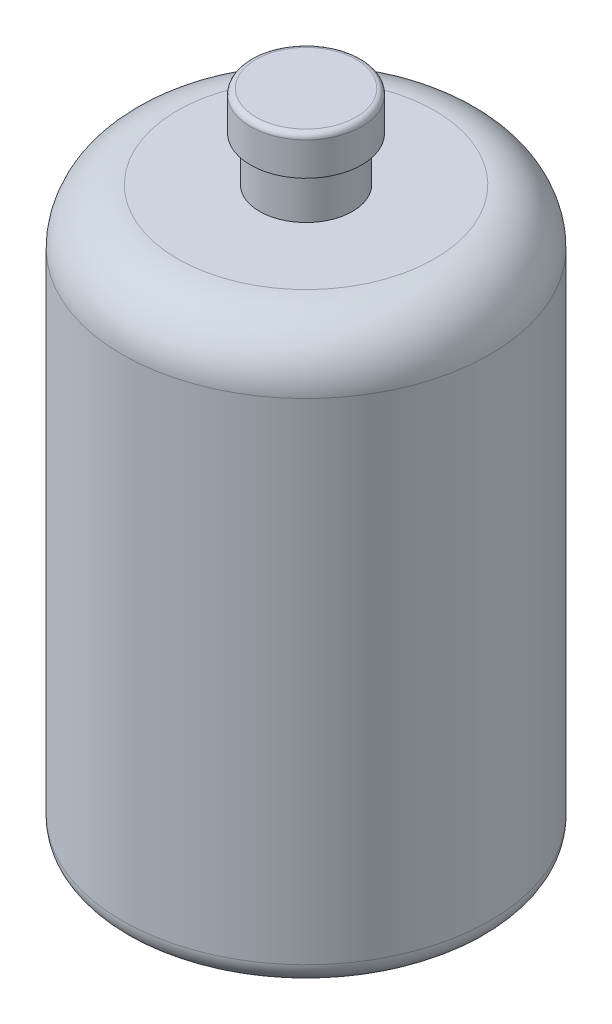
ISO-10303-21;
HEADER;
FILE_DESCRIPTION(('STEP AP214'),'2;1');
FILE_NAME('part.step','',(''),(''),'','','');
FILE_SCHEMA(('AUTOMOTIVE_DESIGN { 1 0 10303 214 1 1 1 1 }'));
ENDSEC;
DATA;
#1=APPLICATION_CONTEXT('core data for automotive mechanical design processes');
#2=APPLICATION_PROTOCOL_DEFINITION('international standard','automotive_design',2000,#1);
#3=PRODUCT_CONTEXT('',#1,'mechanical');
#4=PRODUCT('Part','Part','',(#3));
#5=PRODUCT_RELATED_PRODUCT_CATEGORY('part','',(#4));
#6=PRODUCT_DEFINITION_FORMATION('','',#4);
#7=PRODUCT_DEFINITION_CONTEXT('part definition',#1,'design');
#8=PRODUCT_DEFINITION('design','',#6,#7);
#9=PRODUCT_DEFINITION_SHAPE('','',#8);
#10=(LENGTH_UNIT() NAMED_UNIT(*) SI_UNIT(.MILLI.,.METRE.));
#11=(NAMED_UNIT(*) PLANE_ANGLE_UNIT() SI_UNIT($,.RADIAN.));
#12=(NAMED_UNIT(*) SI_UNIT($,.STERADIAN.) SOLID_ANGLE_UNIT());
#13=UNCERTAINTY_MEASURE_WITH_UNIT(LENGTH_MEASURE(1.E-05),#10,'distance_accuracy_value','');
#14=(GEOMETRIC_REPRESENTATION_CONTEXT(3) GLOBAL_UNCERTAINTY_ASSIGNED_CONTEXT((#13)) GLOBAL_UNIT_ASSIGNED_CONTEXT((#10,
#11,#12)) REPRESENTATION_CONTEXT('',''));
#15=CARTESIAN_POINT('',(0.,0.,0.));
#16=DIRECTION('',(0.,0.,1.));
#17=DIRECTION('',(1.,0.,0.));
#18=AXIS2_PLACEMENT_3D('',#15,#16,#17);
#19=CARTESIAN_POINT('',(0.,102.7,0.));
#20=DIRECTION('',(0.,-1.,0.));
#21=DIRECTION('',(0.,0.,-1.));
#22=AXIS2_PLACEMENT_3D('',#19,#20,#21);
#23=CYLINDRICAL_SURFACE('',#22,33.25);
#24=CARTESIAN_POINT('',(0.,92.7,0.));
#25=DIRECTION('',(0.,1.,0.));
#26=DIRECTION('',(0.,0.,1.));
#27=AXIS2_PLACEMENT_3D('',#24,#25,#26);
#28=CIRCLE('',#27,33.25);
#29=CARTESIAN_POINT('',(0.,92.7,33.25));
#30=VERTEX_POINT('',#29);
#31=EDGE_CURVE('E45',#30,#30,#28,.F.);
#32=ORIENTED_EDGE('',*,*,#31,.T.);
#33=EDGE_LOOP('',(#32));
#34=FACE_BOUND('',#33,.T.);
#35=CARTESIAN_POINT('',(0.,4.,0.));
#36=DIRECTION('',(0.,1.,0.));
#37=DIRECTION('',(0.,0.,1.));
#38=AXIS2_PLACEMENT_3D('',#35,#36,#37);
#39=CIRCLE('',#38,33.25);
#40=CARTESIAN_POINT('',(0.,4.,33.25));
#41=VERTEX_POINT('',#40);
#42=EDGE_CURVE('E57',#41,#41,#39,.T.);
#43=ORIENTED_EDGE('',*,*,#42,.T.);
#44=EDGE_LOOP('',(#43));
#45=FACE_BOUND('',#44,.T.);
#46=ADVANCED_FACE('F34',(#34,#45),#23,.T.);
#47=CARTESIAN_POINT('',(0.,102.7,0.));
#48=DIRECTION('',(0.,1.,0.));
#49=DIRECTION('',(0.,0.,1.));
#50=AXIS2_PLACEMENT_3D('',#47,#48,#49);
#51=PLANE('',#50);
#52=CARTESIAN_POINT('',(0.,102.7,0.));
#53=DIRECTION('',(0.,1.,0.));
#54=DIRECTION('',(0.,0.,1.));
#55=AXIS2_PLACEMENT_3D('',#52,#53,#54);
#56=CIRCLE('',#55,23.25);
#57=CARTESIAN_POINT('',(0.,102.7,23.25));
#58=VERTEX_POINT('',#57);
#59=EDGE_CURVE('E49',#58,#58,#56,.T.);
#60=ORIENTED_EDGE('',*,*,#59,.T.);
#61=EDGE_LOOP('',(#60));
#62=FACE_BOUND('',#61,.T.);
#63=CARTESIAN_POINT('',(0.,102.7,0.));
#64=DIRECTION('',(0.,1.,0.));
#65=DIRECTION('',(0.,0.,1.));
#66=AXIS2_PLACEMENT_3D('',#63,#64,#65);
#67=CIRCLE('',#66,8.4);
#68=CARTESIAN_POINT('',(0.,102.7,8.4));
#69=VERTEX_POINT('',#68);
#70=EDGE_CURVE('E64',#69,#69,#67,.T.);
#71=ORIENTED_EDGE('',*,*,#70,.F.);
#72=EDGE_LOOP('',(#71));
#73=FACE_BOUND('',#72,.T.);
#74=ADVANCED_FACE('F79',(#62,#73),#51,.T.);
#75=CARTESIAN_POINT('',(0.,0.,0.));
#76=DIRECTION('',(0.,1.,0.));
#77=DIRECTION('',(0.,0.,1.));
#78=AXIS2_PLACEMENT_3D('',#75,#76,#77);
#79=PLANE('',#78);
#80=CARTESIAN_POINT('',(0.,0.,0.));
#81=DIRECTION('',(0.,1.,0.));
#82=DIRECTION('',(0.,0.,1.));
#83=AXIS2_PLACEMENT_3D('',#80,#81,#82);
#84=CIRCLE('',#83,29.25);
#85=CARTESIAN_POINT('',(0.,0.,29.25));
#86=VERTEX_POINT('',#85);
#87=EDGE_CURVE('E54',#86,#86,#84,.F.);
#88=ORIENTED_EDGE('',*,*,#87,.T.);
#89=EDGE_LOOP('',(#88));
#90=FACE_BOUND('',#89,.T.);
#91=ADVANCED_FACE('F81',(#90),#79,.F.);
#92=CARTESIAN_POINT('',(0.,4.,0.));
#93=DIRECTION('',(0.,1.,0.));
#94=DIRECTION('',(0.,0.,1.));
#95=AXIS2_PLACEMENT_3D('',#92,#93,#94);
#96=TOROIDAL_SURFACE('',#95,29.25,4.);
#97=ORIENTED_EDGE('',*,*,#87,.F.);
#98=EDGE_LOOP('',(#97));
#99=FACE_BOUND('',#98,.T.);
#100=ORIENTED_EDGE('',*,*,#42,.F.);
#101=EDGE_LOOP('',(#100));
#102=FACE_BOUND('',#101,.T.);
#103=ADVANCED_FACE('F88',(#99,#102),#96,.T.);
#104=CARTESIAN_POINT('',(0.,92.7,0.));
#105=DIRECTION('',(0.,1.,0.));
#106=DIRECTION('',(0.,0.,1.));
#107=AXIS2_PLACEMENT_3D('',#104,#105,#106);
#108=TOROIDAL_SURFACE('',#107,23.25,10.);
#109=ORIENTED_EDGE('',*,*,#31,.F.);
#110=EDGE_LOOP('',(#109));
#111=FACE_BOUND('',#110,.T.);
#112=ORIENTED_EDGE('',*,*,#59,.F.);
#113=EDGE_LOOP('',(#112));
#114=FACE_BOUND('',#113,.T.);
#115=ADVANCED_FACE('F98',(#111,#114),#108,.T.);
#116=CARTESIAN_POINT('',(0.,110.8,0.));
#117=DIRECTION('',(0.,1.,0.));
#118=DIRECTION('',(0.,0.,1.));
#119=AXIS2_PLACEMENT_3D('',#116,#117,#118);
#120=PLANE('',#119);
#121=CARTESIAN_POINT('',(0.,110.8,0.));
#122=DIRECTION('',(0.,1.,0.));
#123=DIRECTION('',(0.,0.,1.));
#124=AXIS2_PLACEMENT_3D('',#121,#122,#123);
#125=CIRCLE('',#124,10.05);
#126=CARTESIAN_POINT('',(0.,110.8,10.05));
#127=VERTEX_POINT('',#126);
#128=EDGE_CURVE('E60',#127,#127,#125,.T.);
#129=ORIENTED_EDGE('',*,*,#128,.F.);
#130=EDGE_LOOP('',(#129));
#131=FACE_BOUND('',#130,.T.);
#132=CARTESIAN_POINT('',(0.,110.8,0.));
#133=DIRECTION('',(0.,1.,0.));
#134=DIRECTION('',(0.,0.,1.));
#135=AXIS2_PLACEMENT_3D('',#132,#133,#134);
#136=CIRCLE('',#135,8.4);
#137=CARTESIAN_POINT('',(0.,110.8,8.4));
#138=VERTEX_POINT('',#137);
#139=EDGE_CURVE('E63',#138,#138,#136,.T.);
#140=ORIENTED_EDGE('',*,*,#139,.T.);
#141=EDGE_LOOP('',(#140));
#142=FACE_BOUND('',#141,.T.);
#143=ADVANCED_FACE('F70',(#131,#142),#120,.F.);
#144=CARTESIAN_POINT('',(0.,110.8,0.));
#145=DIRECTION('',(0.,-1.,0.));
#146=DIRECTION('',(0.,0.,-1.));
#147=AXIS2_PLACEMENT_3D('',#144,#145,#146);
#148=CYLINDRICAL_SURFACE('',#147,8.4);
#149=ORIENTED_EDGE('',*,*,#139,.F.);
#150=EDGE_LOOP('',(#149));
#151=FACE_BOUND('',#150,.T.);
#152=ORIENTED_EDGE('',*,*,#70,.T.);
#153=EDGE_LOOP('',(#152));
#154=FACE_BOUND('',#153,.T.);
#155=ADVANCED_FACE('F72',(#151,#154),#148,.T.);
#156=CARTESIAN_POINT('',(0.,117.8,0.));
#157=DIRECTION('',(0.,1.,0.));
#158=DIRECTION('',(0.,0.,1.));
#159=AXIS2_PLACEMENT_3D('',#156,#157,#158);
#160=PLANE('',#159);
#161=CARTESIAN_POINT('',(0.,117.8,0.));
#162=DIRECTION('',(0.,1.,0.));
#163=DIRECTION('',(0.,0.,1.));
#164=AXIS2_PLACEMENT_3D('',#161,#162,#163);
#165=CIRCLE('',#164,9.05);
#166=CARTESIAN_POINT('',(0.,117.8,9.05));
#167=VERTEX_POINT('',#166);
#168=EDGE_CURVE('E41',#167,#167,#165,.T.);
#169=ORIENTED_EDGE('',*,*,#168,.T.);
#170=EDGE_LOOP('',(#169));
#171=FACE_BOUND('',#170,.T.);
#172=ADVANCED_FACE('F75',(#171),#160,.T.);
#173=CARTESIAN_POINT('',(0.,116.8,0.));
#174=DIRECTION('',(0.,1.,0.));
#175=DIRECTION('',(0.,0.,1.));
#176=AXIS2_PLACEMENT_3D('',#173,#174,#175);
#177=TOROIDAL_SURFACE('',#176,9.05,1.);
#178=CARTESIAN_POINT('',(0.,116.8,0.));
#179=DIRECTION('',(0.,1.,0.));
#180=DIRECTION('',(0.,0.,1.));
#181=AXIS2_PLACEMENT_3D('',#178,#179,#180);
#182=CIRCLE('',#181,10.05);
#183=CARTESIAN_POINT('',(0.,116.8,10.05));
#184=VERTEX_POINT('',#183);
#185=EDGE_CURVE('E10',#184,#184,#182,.F.);
#186=ORIENTED_EDGE('',*,*,#185,.F.);
#187=EDGE_LOOP('',(#186));
#188=FACE_BOUND('',#187,.T.);
#189=ORIENTED_EDGE('',*,*,#168,.F.);
#190=EDGE_LOOP('',(#189));
#191=FACE_BOUND('',#190,.T.);
#192=ADVANCED_FACE('F36',(#188,#191),#177,.T.);
#193=CARTESIAN_POINT('',(0.,117.8,0.));
#194=DIRECTION('',(0.,-1.,0.));
#195=DIRECTION('',(0.,0.,-1.));
#196=AXIS2_PLACEMENT_3D('',#193,#194,#195);
#197=CYLINDRICAL_SURFACE('',#196,10.05);
#198=ORIENTED_EDGE('',*,*,#128,.T.);
#199=EDGE_LOOP('',(#198));
#200=FACE_BOUND('',#199,.T.);
#201=ORIENTED_EDGE('',*,*,#185,.T.);
#202=EDGE_LOOP('',(#201));
#203=FACE_BOUND('',#202,.T.);
#204=ADVANCED_FACE('F94',(#200,#203),#197,.T.);
#205=CLOSED_SHELL('',(#46,#74,#91,#103,#115,#143,#155,#172,#192,#204));
#206=MANIFOLD_SOLID_BREP('B2',#205);
#207=ADVANCED_BREP_SHAPE_REPRESENTATION('',(#18,#206),#14);
#208=SHAPE_DEFINITION_REPRESENTATION(#9,#207);
ENDSEC;
END-ISO-10303-21;
